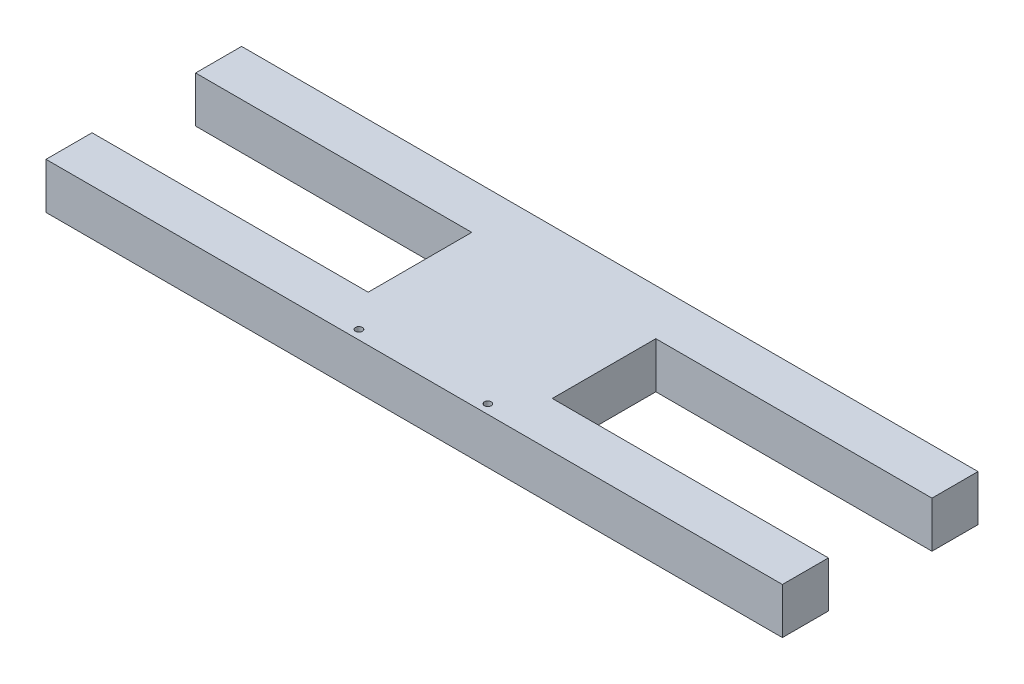
ISO-10303-21;
HEADER;
FILE_DESCRIPTION(('STEP AP214'),'2;1');
FILE_NAME('part.step','',(''),(''),'','','');
FILE_SCHEMA(('AUTOMOTIVE_DESIGN { 1 0 10303 214 1 1 1 1 }'));
ENDSEC;
DATA;
#1=APPLICATION_CONTEXT('core data for automotive mechanical design processes');
#2=APPLICATION_PROTOCOL_DEFINITION('international standard','automotive_design',2000,#1);
#3=PRODUCT_CONTEXT('',#1,'mechanical');
#4=PRODUCT('Part','Part','',(#3));
#5=PRODUCT_RELATED_PRODUCT_CATEGORY('part','',(#4));
#6=PRODUCT_DEFINITION_FORMATION('','',#4);
#7=PRODUCT_DEFINITION_CONTEXT('part definition',#1,'design');
#8=PRODUCT_DEFINITION('design','',#6,#7);
#9=PRODUCT_DEFINITION_SHAPE('','',#8);
#10=(LENGTH_UNIT() NAMED_UNIT(*) SI_UNIT(.MILLI.,.METRE.));
#11=(NAMED_UNIT(*) PLANE_ANGLE_UNIT() SI_UNIT($,.RADIAN.));
#12=(NAMED_UNIT(*) SI_UNIT($,.STERADIAN.) SOLID_ANGLE_UNIT());
#13=UNCERTAINTY_MEASURE_WITH_UNIT(LENGTH_MEASURE(1.E-05),#10,'distance_accuracy_value','');
#14=(GEOMETRIC_REPRESENTATION_CONTEXT(3) GLOBAL_UNCERTAINTY_ASSIGNED_CONTEXT((#13)) GLOBAL_UNIT_ASSIGNED_CONTEXT((#10,
#11,#12)) REPRESENTATION_CONTEXT('',''));
#15=CARTESIAN_POINT('',(0.,0.,0.));
#16=DIRECTION('',(0.,0.,1.));
#17=DIRECTION('',(1.,0.,0.));
#18=AXIS2_PLACEMENT_3D('',#15,#16,#17);
#19=CARTESIAN_POINT('',(0.,20.,22.5));
#20=DIRECTION('',(0.,0.,-1.));
#21=DIRECTION('',(-1.,0.,0.));
#22=AXIS2_PLACEMENT_3D('',#19,#20,#21);
#23=PLANE('',#22);
#24=DIRECTION('',(1.,0.,0.));
#25=VECTOR('',#24,1.);
#26=CARTESIAN_POINT('',(0.,0.,22.5));
#27=LINE('',#26,#25);
#28=CARTESIAN_POINT('',(-160.,0.,22.5));
#29=VERTEX_POINT('',#28);
#30=CARTESIAN_POINT('',(-40.,0.,22.5));
#31=VERTEX_POINT('',#30);
#32=EDGE_CURVE('E185',#29,#31,#27,.T.);
#33=ORIENTED_EDGE('',*,*,#32,.F.);
#34=DIRECTION('',(0.,-1.,0.));
#35=VECTOR('',#34,1.);
#36=CARTESIAN_POINT('',(-160.,20.,22.5));
#37=LINE('',#36,#35);
#38=CARTESIAN_POINT('',(-160.,20.,22.5));
#39=VERTEX_POINT('',#38);
#40=EDGE_CURVE('E11',#39,#29,#37,.T.);
#41=ORIENTED_EDGE('',*,*,#40,.F.);
#42=DIRECTION('',(1.,0.,0.));
#43=VECTOR('',#42,1.);
#44=CARTESIAN_POINT('',(0.,20.,22.5));
#45=LINE('',#44,#43);
#46=CARTESIAN_POINT('',(-40.,20.,22.5));
#47=VERTEX_POINT('',#46);
#48=EDGE_CURVE('E165',#39,#47,#45,.T.);
#49=ORIENTED_EDGE('',*,*,#48,.T.);
#50=DIRECTION('',(0.,-1.,0.));
#51=VECTOR('',#50,1.);
#52=CARTESIAN_POINT('',(-40.,20.,22.5));
#53=LINE('',#52,#51);
#54=EDGE_CURVE('E98',#47,#31,#53,.T.);
#55=ORIENTED_EDGE('',*,*,#54,.T.);
#56=EDGE_LOOP('',(#33,#41,#49,#55));
#57=FACE_BOUND('',#56,.T.);
#58=ADVANCED_FACE('F34',(#57),#23,.T.);
#59=CARTESIAN_POINT('',(-160.,20.,0.));
#60=DIRECTION('',(1.,0.,0.));
#61=DIRECTION('',(0.,0.,-1.));
#62=AXIS2_PLACEMENT_3D('',#59,#60,#61);
#63=PLANE('',#62);
#64=DIRECTION('',(0.,0.,1.));
#65=VECTOR('',#64,1.);
#66=CARTESIAN_POINT('',(-160.,0.,0.));
#67=LINE('',#66,#65);
#68=CARTESIAN_POINT('',(-160.,0.,42.5));
#69=VERTEX_POINT('',#68);
#70=EDGE_CURVE('E189',#29,#69,#67,.T.);
#71=ORIENTED_EDGE('',*,*,#70,.T.);
#72=DIRECTION('',(0.,-1.,0.));
#73=VECTOR('',#72,1.);
#74=CARTESIAN_POINT('',(-160.,20.,42.5));
#75=LINE('',#74,#73);
#76=CARTESIAN_POINT('',(-160.,20.,42.5));
#77=VERTEX_POINT('',#76);
#78=EDGE_CURVE('E43',#77,#69,#75,.T.);
#79=ORIENTED_EDGE('',*,*,#78,.F.);
#80=DIRECTION('',(0.,0.,1.));
#81=VECTOR('',#80,1.);
#82=CARTESIAN_POINT('',(-160.,20.,0.));
#83=LINE('',#82,#81);
#84=EDGE_CURVE('E171',#39,#77,#83,.T.);
#85=ORIENTED_EDGE('',*,*,#84,.F.);
#86=ORIENTED_EDGE('',*,*,#40,.T.);
#87=EDGE_LOOP('',(#71,#79,#85,#86));
#88=FACE_BOUND('',#87,.T.);
#89=ADVANCED_FACE('F36',(#88),#63,.F.);
#90=CARTESIAN_POINT('',(0.,20.,42.5));
#91=DIRECTION('',(0.,0.,-1.));
#92=DIRECTION('',(-1.,0.,0.));
#93=AXIS2_PLACEMENT_3D('',#90,#91,#92);
#94=PLANE('',#93);
#95=DIRECTION('',(1.,0.,0.));
#96=VECTOR('',#95,1.);
#97=CARTESIAN_POINT('',(0.,0.,42.5));
#98=LINE('',#97,#96);
#99=CARTESIAN_POINT('',(160.,0.,42.5));
#100=VERTEX_POINT('',#99);
#101=EDGE_CURVE('E195',#69,#100,#98,.T.);
#102=ORIENTED_EDGE('',*,*,#101,.T.);
#103=DIRECTION('',(0.,-1.,0.));
#104=VECTOR('',#103,1.);
#105=CARTESIAN_POINT('',(160.,20.,42.5));
#106=LINE('',#105,#104);
#107=CARTESIAN_POINT('',(160.,20.,42.5));
#108=VERTEX_POINT('',#107);
#109=EDGE_CURVE('E234',#108,#100,#106,.T.);
#110=ORIENTED_EDGE('',*,*,#109,.F.);
#111=DIRECTION('',(1.,0.,0.));
#112=VECTOR('',#111,1.);
#113=CARTESIAN_POINT('',(0.,20.,42.5));
#114=LINE('',#113,#112);
#115=EDGE_CURVE('E169',#77,#108,#114,.T.);
#116=ORIENTED_EDGE('',*,*,#115,.F.);
#117=ORIENTED_EDGE('',*,*,#78,.T.);
#118=EDGE_LOOP('',(#102,#110,#116,#117));
#119=FACE_BOUND('',#118,.T.);
#120=ADVANCED_FACE('F239',(#119),#94,.F.);
#121=CARTESIAN_POINT('',(160.,20.,0.));
#122=DIRECTION('',(1.,0.,0.));
#123=DIRECTION('',(0.,0.,-1.));
#124=AXIS2_PLACEMENT_3D('',#121,#122,#123);
#125=PLANE('',#124);
#126=DIRECTION('',(0.,0.,1.));
#127=VECTOR('',#126,1.);
#128=CARTESIAN_POINT('',(160.,0.,0.));
#129=LINE('',#128,#127);
#130=CARTESIAN_POINT('',(160.,0.,22.5));
#131=VERTEX_POINT('',#130);
#132=EDGE_CURVE('E199',#131,#100,#129,.T.);
#133=ORIENTED_EDGE('',*,*,#132,.F.);
#134=DIRECTION('',(0.,-1.,0.));
#135=VECTOR('',#134,1.);
#136=CARTESIAN_POINT('',(160.,20.,22.5));
#137=LINE('',#136,#135);
#138=CARTESIAN_POINT('',(160.,20.,22.5));
#139=VERTEX_POINT('',#138);
#140=EDGE_CURVE('E232',#139,#131,#137,.T.);
#141=ORIENTED_EDGE('',*,*,#140,.F.);
#142=DIRECTION('',(0.,0.,1.));
#143=VECTOR('',#142,1.);
#144=CARTESIAN_POINT('',(160.,20.,0.));
#145=LINE('',#144,#143);
#146=EDGE_CURVE('E163',#139,#108,#145,.T.);
#147=ORIENTED_EDGE('',*,*,#146,.T.);
#148=ORIENTED_EDGE('',*,*,#109,.T.);
#149=EDGE_LOOP('',(#133,#141,#147,#148));
#150=FACE_BOUND('',#149,.T.);
#151=ADVANCED_FACE('F253',(#150),#125,.T.);
#152=CARTESIAN_POINT('',(40.,0.,22.5));
#153=VERTEX_POINT('',#152);
#154=EDGE_CURVE('E191',#153,#131,#27,.T.);
#155=ORIENTED_EDGE('',*,*,#154,.F.);
#156=DIRECTION('',(0.,-1.,0.));
#157=VECTOR('',#156,1.);
#158=CARTESIAN_POINT('',(40.,20.,22.5));
#159=LINE('',#158,#157);
#160=CARTESIAN_POINT('',(40.,20.,22.5));
#161=VERTEX_POINT('',#160);
#162=EDGE_CURVE('E230',#161,#153,#159,.T.);
#163=ORIENTED_EDGE('',*,*,#162,.F.);
#164=EDGE_CURVE('E160',#161,#139,#45,.T.);
#165=ORIENTED_EDGE('',*,*,#164,.T.);
#166=ORIENTED_EDGE('',*,*,#140,.T.);
#167=EDGE_LOOP('',(#155,#163,#165,#166));
#168=FACE_BOUND('',#167,.T.);
#169=ADVANCED_FACE('F245',(#168),#23,.T.);
#170=CARTESIAN_POINT('',(40.,20.,0.));
#171=DIRECTION('',(1.,0.,0.));
#172=DIRECTION('',(0.,0.,-1.));
#173=AXIS2_PLACEMENT_3D('',#170,#171,#172);
#174=PLANE('',#173);
#175=DIRECTION('',(0.,0.,1.));
#176=VECTOR('',#175,1.);
#177=CARTESIAN_POINT('',(40.,0.,0.));
#178=LINE('',#177,#176);
#179=CARTESIAN_POINT('',(40.,0.,-22.5));
#180=VERTEX_POINT('',#179);
#181=EDGE_CURVE('E198',#180,#153,#178,.T.);
#182=ORIENTED_EDGE('',*,*,#181,.F.);
#183=DIRECTION('',(0.,-1.,0.));
#184=VECTOR('',#183,1.);
#185=CARTESIAN_POINT('',(40.,20.,-22.5));
#186=LINE('',#185,#184);
#187=CARTESIAN_POINT('',(40.,20.,-22.5));
#188=VERTEX_POINT('',#187);
#189=EDGE_CURVE('E228',#188,#180,#186,.T.);
#190=ORIENTED_EDGE('',*,*,#189,.F.);
#191=DIRECTION('',(0.,0.,1.));
#192=VECTOR('',#191,1.);
#193=CARTESIAN_POINT('',(40.,20.,0.));
#194=LINE('',#193,#192);
#195=EDGE_CURVE('E154',#188,#161,#194,.T.);
#196=ORIENTED_EDGE('',*,*,#195,.T.);
#197=ORIENTED_EDGE('',*,*,#162,.T.);
#198=EDGE_LOOP('',(#182,#190,#196,#197));
#199=FACE_BOUND('',#198,.T.);
#200=ADVANCED_FACE('F252',(#199),#174,.T.);
#201=CARTESIAN_POINT('',(0.,20.,-22.5));
#202=DIRECTION('',(0.,0.,-1.));
#203=DIRECTION('',(-1.,0.,0.));
#204=AXIS2_PLACEMENT_3D('',#201,#202,#203);
#205=PLANE('',#204);
#206=DIRECTION('',(1.,0.,0.));
#207=VECTOR('',#206,1.);
#208=CARTESIAN_POINT('',(0.,0.,-22.5));
#209=LINE('',#208,#207);
#210=CARTESIAN_POINT('',(160.,0.,-22.5));
#211=VERTEX_POINT('',#210);
#212=EDGE_CURVE('E203',#180,#211,#209,.T.);
#213=ORIENTED_EDGE('',*,*,#212,.T.);
#214=DIRECTION('',(0.,-1.,0.));
#215=VECTOR('',#214,1.);
#216=CARTESIAN_POINT('',(160.,20.,-22.5));
#217=LINE('',#216,#215);
#218=CARTESIAN_POINT('',(160.,20.,-22.5));
#219=VERTEX_POINT('',#218);
#220=EDGE_CURVE('E226',#219,#211,#217,.T.);
#221=ORIENTED_EDGE('',*,*,#220,.F.);
#222=DIRECTION('',(1.,0.,0.));
#223=VECTOR('',#222,1.);
#224=CARTESIAN_POINT('',(0.,20.,-22.5));
#225=LINE('',#224,#223);
#226=EDGE_CURVE('E149',#188,#219,#225,.T.);
#227=ORIENTED_EDGE('',*,*,#226,.F.);
#228=ORIENTED_EDGE('',*,*,#189,.T.);
#229=EDGE_LOOP('',(#213,#221,#227,#228));
#230=FACE_BOUND('',#229,.T.);
#231=ADVANCED_FACE('F259',(#230),#205,.F.);
#232=CARTESIAN_POINT('',(160.,20.,0.));
#233=DIRECTION('',(1.,0.,0.));
#234=DIRECTION('',(0.,0.,-1.));
#235=AXIS2_PLACEMENT_3D('',#232,#233,#234);
#236=PLANE('',#235);
#237=DIRECTION('',(0.,0.,1.));
#238=VECTOR('',#237,1.);
#239=CARTESIAN_POINT('',(160.,0.,0.));
#240=LINE('',#239,#238);
#241=CARTESIAN_POINT('',(160.,0.,-42.5));
#242=VERTEX_POINT('',#241);
#243=EDGE_CURVE('E213',#242,#211,#240,.T.);
#244=ORIENTED_EDGE('',*,*,#243,.F.);
#245=DIRECTION('',(0.,-1.,0.));
#246=VECTOR('',#245,1.);
#247=CARTESIAN_POINT('',(160.,20.,-42.5));
#248=LINE('',#247,#246);
#249=CARTESIAN_POINT('',(160.,20.,-42.5));
#250=VERTEX_POINT('',#249);
#251=EDGE_CURVE('E224',#250,#242,#248,.T.);
#252=ORIENTED_EDGE('',*,*,#251,.F.);
#253=DIRECTION('',(0.,0.,1.));
#254=VECTOR('',#253,1.);
#255=CARTESIAN_POINT('',(160.,20.,0.));
#256=LINE('',#255,#254);
#257=EDGE_CURVE('E153',#250,#219,#256,.T.);
#258=ORIENTED_EDGE('',*,*,#257,.T.);
#259=ORIENTED_EDGE('',*,*,#220,.T.);
#260=EDGE_LOOP('',(#244,#252,#258,#259));
#261=FACE_BOUND('',#260,.T.);
#262=ADVANCED_FACE('F268',(#261),#236,.T.);
#263=CARTESIAN_POINT('',(0.,20.,-42.5));
#264=DIRECTION('',(0.,0.,-1.));
#265=DIRECTION('',(-1.,0.,0.));
#266=AXIS2_PLACEMENT_3D('',#263,#264,#265);
#267=PLANE('',#266);
#268=DIRECTION('',(1.,0.,0.));
#269=VECTOR('',#268,1.);
#270=CARTESIAN_POINT('',(0.,0.,-42.5));
#271=LINE('',#270,#269);
#272=CARTESIAN_POINT('',(-160.,0.,-42.5));
#273=VERTEX_POINT('',#272);
#274=EDGE_CURVE('E216',#273,#242,#271,.T.);
#275=ORIENTED_EDGE('',*,*,#274,.F.);
#276=DIRECTION('',(0.,-1.,0.));
#277=VECTOR('',#276,1.);
#278=CARTESIAN_POINT('',(-160.,20.,-42.5));
#279=LINE('',#278,#277);
#280=CARTESIAN_POINT('',(-160.,20.,-42.5));
#281=VERTEX_POINT('',#280);
#282=EDGE_CURVE('E144',#281,#273,#279,.T.);
#283=ORIENTED_EDGE('',*,*,#282,.F.);
#284=DIRECTION('',(1.,0.,0.));
#285=VECTOR('',#284,1.);
#286=CARTESIAN_POINT('',(0.,20.,-42.5));
#287=LINE('',#286,#285);
#288=EDGE_CURVE('E137',#281,#250,#287,.T.);
#289=ORIENTED_EDGE('',*,*,#288,.T.);
#290=ORIENTED_EDGE('',*,*,#251,.T.);
#291=EDGE_LOOP('',(#275,#283,#289,#290));
#292=FACE_BOUND('',#291,.T.);
#293=ADVANCED_FACE('F271',(#292),#267,.T.);
#294=CARTESIAN_POINT('',(-160.,20.,0.));
#295=DIRECTION('',(1.,0.,0.));
#296=DIRECTION('',(0.,0.,-1.));
#297=AXIS2_PLACEMENT_3D('',#294,#295,#296);
#298=PLANE('',#297);
#299=DIRECTION('',(0.,0.,1.));
#300=VECTOR('',#299,1.);
#301=CARTESIAN_POINT('',(-160.,0.,0.));
#302=LINE('',#301,#300);
#303=CARTESIAN_POINT('',(-160.,0.,-22.5));
#304=VERTEX_POINT('',#303);
#305=EDGE_CURVE('E143',#273,#304,#302,.T.);
#306=ORIENTED_EDGE('',*,*,#305,.T.);
#307=DIRECTION('',(0.,-1.,0.));
#308=VECTOR('',#307,1.);
#309=CARTESIAN_POINT('',(-160.,20.,-22.5));
#310=LINE('',#309,#308);
#311=CARTESIAN_POINT('',(-160.,20.,-22.5));
#312=VERTEX_POINT('',#311);
#313=EDGE_CURVE('E140',#312,#304,#310,.T.);
#314=ORIENTED_EDGE('',*,*,#313,.F.);
#315=DIRECTION('',(0.,0.,1.));
#316=VECTOR('',#315,1.);
#317=CARTESIAN_POINT('',(-160.,20.,0.));
#318=LINE('',#317,#316);
#319=EDGE_CURVE('E130',#281,#312,#318,.T.);
#320=ORIENTED_EDGE('',*,*,#319,.F.);
#321=ORIENTED_EDGE('',*,*,#282,.T.);
#322=EDGE_LOOP('',(#306,#314,#320,#321));
#323=FACE_BOUND('',#322,.T.);
#324=ADVANCED_FACE('F141',(#323),#298,.F.);
#325=CARTESIAN_POINT('',(-40.,0.,-22.5));
#326=VERTEX_POINT('',#325);
#327=EDGE_CURVE('E91',#304,#326,#209,.T.);
#328=ORIENTED_EDGE('',*,*,#327,.T.);
#329=DIRECTION('',(0.,-1.,0.));
#330=VECTOR('',#329,1.);
#331=CARTESIAN_POINT('',(-40.,20.,-22.5));
#332=LINE('',#331,#330);
#333=CARTESIAN_POINT('',(-40.,20.,-22.5));
#334=VERTEX_POINT('',#333);
#335=EDGE_CURVE('E145',#334,#326,#332,.T.);
#336=ORIENTED_EDGE('',*,*,#335,.F.);
#337=EDGE_CURVE('E134',#312,#334,#225,.T.);
#338=ORIENTED_EDGE('',*,*,#337,.F.);
#339=ORIENTED_EDGE('',*,*,#313,.T.);
#340=EDGE_LOOP('',(#328,#336,#338,#339));
#341=FACE_BOUND('',#340,.T.);
#342=ADVANCED_FACE('F147',(#341),#205,.F.);
#343=CARTESIAN_POINT('',(-40.,20.,0.));
#344=DIRECTION('',(1.,0.,0.));
#345=DIRECTION('',(0.,0.,-1.));
#346=AXIS2_PLACEMENT_3D('',#343,#344,#345);
#347=PLANE('',#346);
#348=DIRECTION('',(0.,0.,1.));
#349=VECTOR('',#348,1.);
#350=CARTESIAN_POINT('',(-40.,0.,0.));
#351=LINE('',#350,#349);
#352=EDGE_CURVE('E173',#326,#31,#351,.T.);
#353=ORIENTED_EDGE('',*,*,#352,.T.);
#354=ORIENTED_EDGE('',*,*,#54,.F.);
#355=DIRECTION('',(0.,0.,1.));
#356=VECTOR('',#355,1.);
#357=CARTESIAN_POINT('',(-40.,20.,0.));
#358=LINE('',#357,#356);
#359=EDGE_CURVE('E51',#334,#47,#358,.T.);
#360=ORIENTED_EDGE('',*,*,#359,.F.);
#361=ORIENTED_EDGE('',*,*,#335,.T.);
#362=EDGE_LOOP('',(#353,#354,#360,#361));
#363=FACE_BOUND('',#362,.T.);
#364=ADVANCED_FACE('F274',(#363),#347,.F.);
#365=CARTESIAN_POINT('',(0.,20.,0.));
#366=DIRECTION('',(0.,1.,0.));
#367=DIRECTION('',(0.,0.,1.));
#368=AXIS2_PLACEMENT_3D('',#365,#366,#367);
#369=PLANE('',#368);
#370=CARTESIAN_POINT('',(-28.,20.,38.5));
#371=DIRECTION('',(0.,1.,0.));
#372=DIRECTION('',(0.,0.,1.));
#373=AXIS2_PLACEMENT_3D('',#370,#371,#372);
#374=CIRCLE('',#373,1.5);
#375=CARTESIAN_POINT('',(-28.,20.,40.));
#376=VERTEX_POINT('',#375);
#377=EDGE_CURVE('E180',#376,#376,#374,.T.);
#378=ORIENTED_EDGE('',*,*,#377,.F.);
#379=EDGE_LOOP('',(#378));
#380=FACE_BOUND('',#379,.T.);
#381=CARTESIAN_POINT('',(28.,20.,38.5));
#382=DIRECTION('',(0.,1.,0.));
#383=DIRECTION('',(0.,0.,1.));
#384=AXIS2_PLACEMENT_3D('',#381,#382,#383);
#385=CIRCLE('',#384,1.5);
#386=CARTESIAN_POINT('',(28.,20.,40.));
#387=VERTEX_POINT('',#386);
#388=EDGE_CURVE('E177',#387,#387,#385,.T.);
#389=ORIENTED_EDGE('',*,*,#388,.F.);
#390=EDGE_LOOP('',(#389));
#391=FACE_BOUND('',#390,.T.);
#392=ORIENTED_EDGE('',*,*,#48,.F.);
#393=ORIENTED_EDGE('',*,*,#84,.T.);
#394=ORIENTED_EDGE('',*,*,#115,.T.);
#395=ORIENTED_EDGE('',*,*,#146,.F.);
#396=ORIENTED_EDGE('',*,*,#164,.F.);
#397=ORIENTED_EDGE('',*,*,#195,.F.);
#398=ORIENTED_EDGE('',*,*,#226,.T.);
#399=ORIENTED_EDGE('',*,*,#257,.F.);
#400=ORIENTED_EDGE('',*,*,#288,.F.);
#401=ORIENTED_EDGE('',*,*,#319,.T.);
#402=ORIENTED_EDGE('',*,*,#337,.T.);
#403=ORIENTED_EDGE('',*,*,#359,.T.);
#404=EDGE_LOOP('',(#392,#393,#394,#395,#396,#397,#398,#399,#400,#401,#402,#403));
#405=FACE_BOUND('',#404,.T.);
#406=ADVANCED_FACE('F132',(#380,#391,#405),#369,.T.);
#407=CARTESIAN_POINT('',(0.,0.,0.));
#408=DIRECTION('',(0.,1.,0.));
#409=DIRECTION('',(0.,0.,1.));
#410=AXIS2_PLACEMENT_3D('',#407,#408,#409);
#411=PLANE('',#410);
#412=CARTESIAN_POINT('',(-28.,0.,38.5));
#413=DIRECTION('',(0.,1.,0.));
#414=DIRECTION('',(0.,0.,1.));
#415=AXIS2_PLACEMENT_3D('',#412,#413,#414);
#416=CIRCLE('',#415,1.5);
#417=CARTESIAN_POINT('',(-28.,0.,40.));
#418=VERTEX_POINT('',#417);
#419=EDGE_CURVE('E183',#418,#418,#416,.T.);
#420=ORIENTED_EDGE('',*,*,#419,.T.);
#421=EDGE_LOOP('',(#420));
#422=FACE_BOUND('',#421,.T.);
#423=CARTESIAN_POINT('',(28.,0.,38.5));
#424=DIRECTION('',(0.,1.,0.));
#425=DIRECTION('',(0.,0.,1.));
#426=AXIS2_PLACEMENT_3D('',#423,#424,#425);
#427=CIRCLE('',#426,1.5);
#428=CARTESIAN_POINT('',(28.,0.,40.));
#429=VERTEX_POINT('',#428);
#430=EDGE_CURVE('E174',#429,#429,#427,.T.);
#431=ORIENTED_EDGE('',*,*,#430,.T.);
#432=EDGE_LOOP('',(#431));
#433=FACE_BOUND('',#432,.T.);
#434=ORIENTED_EDGE('',*,*,#32,.T.);
#435=ORIENTED_EDGE('',*,*,#352,.F.);
#436=ORIENTED_EDGE('',*,*,#327,.F.);
#437=ORIENTED_EDGE('',*,*,#305,.F.);
#438=ORIENTED_EDGE('',*,*,#274,.T.);
#439=ORIENTED_EDGE('',*,*,#243,.T.);
#440=ORIENTED_EDGE('',*,*,#212,.F.);
#441=ORIENTED_EDGE('',*,*,#181,.T.);
#442=ORIENTED_EDGE('',*,*,#154,.T.);
#443=ORIENTED_EDGE('',*,*,#132,.T.);
#444=ORIENTED_EDGE('',*,*,#101,.F.);
#445=ORIENTED_EDGE('',*,*,#70,.F.);
#446=EDGE_LOOP('',(#434,#435,#436,#437,#438,#439,#440,#441,#442,#443,#444,#445));
#447=FACE_BOUND('',#446,.T.);
#448=ADVANCED_FACE('F242',(#422,#433,#447),#411,.F.);
#449=CARTESIAN_POINT('',(28.,0.,38.5));
#450=DIRECTION('',(0.,1.,0.));
#451=DIRECTION('',(0.,0.,1.));
#452=AXIS2_PLACEMENT_3D('',#449,#450,#451);
#453=CYLINDRICAL_SURFACE('',#452,1.5);
#454=ORIENTED_EDGE('',*,*,#430,.F.);
#455=EDGE_LOOP('',(#454));
#456=FACE_BOUND('',#455,.T.);
#457=ORIENTED_EDGE('',*,*,#388,.T.);
#458=EDGE_LOOP('',(#457));
#459=FACE_BOUND('',#458,.T.);
#460=ADVANCED_FACE('F403',(#456,#459),#453,.F.);
#461=CARTESIAN_POINT('',(-28.,0.,38.5));
#462=DIRECTION('',(0.,1.,0.));
#463=DIRECTION('',(0.,0.,1.));
#464=AXIS2_PLACEMENT_3D('',#461,#462,#463);
#465=CYLINDRICAL_SURFACE('',#464,1.5);
#466=ORIENTED_EDGE('',*,*,#419,.F.);
#467=EDGE_LOOP('',(#466));
#468=FACE_BOUND('',#467,.T.);
#469=ORIENTED_EDGE('',*,*,#377,.T.);
#470=EDGE_LOOP('',(#469));
#471=FACE_BOUND('',#470,.T.);
#472=ADVANCED_FACE('F416',(#468,#471),#465,.F.);
#473=CLOSED_SHELL('',(#58,#89,#120,#151,#169,#200,#231,#262,#293,#324,#342,#364,#406,#448,#460,#472));
#474=MANIFOLD_SOLID_BREP('B2',#473);
#475=ADVANCED_BREP_SHAPE_REPRESENTATION('',(#18,#474),#14);
#476=SHAPE_DEFINITION_REPRESENTATION(#9,#475);
ENDSEC;
END-ISO-10303-21;
